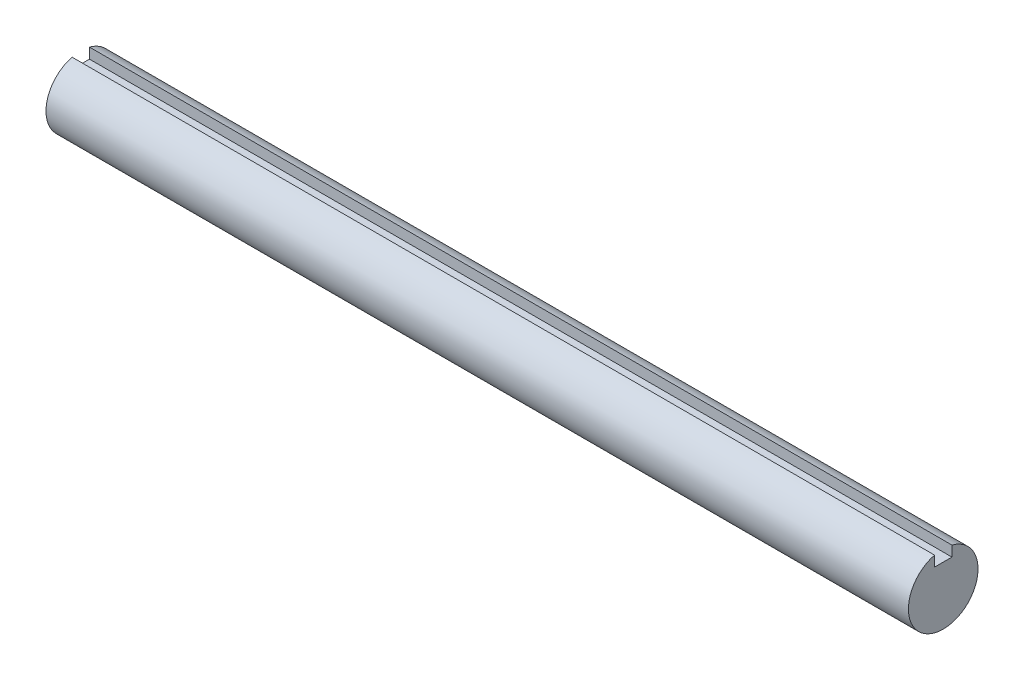
ISO-10303-21;
HEADER;
FILE_DESCRIPTION(('STEP AP214'),'2;1');
FILE_NAME('part.step','',(''),(''),'','','');
FILE_SCHEMA(('AUTOMOTIVE_DESIGN { 1 0 10303 214 1 1 1 1 }'));
ENDSEC;
DATA;
#1=APPLICATION_CONTEXT('core data for automotive mechanical design processes');
#2=APPLICATION_PROTOCOL_DEFINITION('international standard','automotive_design',2000,#1);
#3=PRODUCT_CONTEXT('',#1,'mechanical');
#4=PRODUCT('Part','Part','',(#3));
#5=PRODUCT_RELATED_PRODUCT_CATEGORY('part','',(#4));
#6=PRODUCT_DEFINITION_FORMATION('','',#4);
#7=PRODUCT_DEFINITION_CONTEXT('part definition',#1,'design');
#8=PRODUCT_DEFINITION('design','',#6,#7);
#9=PRODUCT_DEFINITION_SHAPE('','',#8);
#10=(LENGTH_UNIT() NAMED_UNIT(*) SI_UNIT(.MILLI.,.METRE.));
#11=(NAMED_UNIT(*) PLANE_ANGLE_UNIT() SI_UNIT($,.RADIAN.));
#12=(NAMED_UNIT(*) SI_UNIT($,.STERADIAN.) SOLID_ANGLE_UNIT());
#13=UNCERTAINTY_MEASURE_WITH_UNIT(LENGTH_MEASURE(1.E-05),#10,'distance_accuracy_value','');
#14=(GEOMETRIC_REPRESENTATION_CONTEXT(3) GLOBAL_UNCERTAINTY_ASSIGNED_CONTEXT((#13)) GLOBAL_UNIT_ASSIGNED_CONTEXT((#10,
#11,#12)) REPRESENTATION_CONTEXT('',''));
#15=CARTESIAN_POINT('',(0.,0.,0.));
#16=DIRECTION('',(0.,0.,1.));
#17=DIRECTION('',(1.,0.,0.));
#18=AXIS2_PLACEMENT_3D('',#15,#16,#17);
#19=CARTESIAN_POINT('',(0.,0.,0.));
#20=DIRECTION('',(1.,0.,0.));
#21=DIRECTION('',(0.,0.,-1.));
#22=AXIS2_PLACEMENT_3D('',#19,#20,#21);
#23=PLANE('',#22);
#24=CARTESIAN_POINT('',(0.,0.,0.));
#25=DIRECTION('',(1.,0.,0.));
#26=DIRECTION('',(0.,0.,-1.));
#27=AXIS2_PLACEMENT_3D('',#24,#25,#26);
#28=CIRCLE('',#27,4.000000001);
#29=CARTESIAN_POINT('',(0.,3.87298334724021,1.));
#30=VERTEX_POINT('',#29);
#31=CARTESIAN_POINT('',(0.,3.87298334724021,-1.));
#32=VERTEX_POINT('',#31);
#33=EDGE_CURVE('E106',#30,#32,#28,.T.);
#34=ORIENTED_EDGE('',*,*,#33,.F.);
#35=DIRECTION('',(0.,1.,0.));
#36=VECTOR('',#35,1.);
#37=CARTESIAN_POINT('',(0.,3.87298334724021,1.));
#38=LINE('',#37,#36);
#39=CARTESIAN_POINT('',(0.,2.67298334724021,1.));
#40=VERTEX_POINT('',#39);
#41=EDGE_CURVE('E121',#40,#30,#38,.T.);
#42=ORIENTED_EDGE('',*,*,#41,.F.);
#43=DIRECTION('',(0.,0.,1.));
#44=VECTOR('',#43,1.);
#45=CARTESIAN_POINT('',(0.,2.67298334724021,1.));
#46=LINE('',#45,#44);
#47=CARTESIAN_POINT('',(0.,2.67298334724021,-1.));
#48=VERTEX_POINT('',#47);
#49=EDGE_CURVE('E108',#48,#40,#46,.T.);
#50=ORIENTED_EDGE('',*,*,#49,.F.);
#51=DIRECTION('',(0.,-1.,0.));
#52=VECTOR('',#51,1.);
#53=CARTESIAN_POINT('',(0.,3.87298334724021,-1.));
#54=LINE('',#53,#52);
#55=EDGE_CURVE('E97',#32,#48,#54,.T.);
#56=ORIENTED_EDGE('',*,*,#55,.F.);
#57=EDGE_LOOP('',(#34,#42,#50,#56));
#58=FACE_BOUND('',#57,.T.);
#59=ADVANCED_FACE('F51',(#58),#23,.F.);
#60=CARTESIAN_POINT('',(110.347753508972,3.87298334724021,1.));
#61=DIRECTION('',(0.,0.,1.));
#62=DIRECTION('',(0.,-1.,0.));
#63=AXIS2_PLACEMENT_3D('',#60,#61,#62);
#64=PLANE('',#63);
#65=DIRECTION('',(-1.,0.,0.));
#66=VECTOR('',#65,1.);
#67=CARTESIAN_POINT('',(110.347753508972,3.87298334724021,1.));
#68=LINE('',#67,#66);
#69=CARTESIAN_POINT('',(99.1234999999998,3.87298334724021,1.));
#70=VERTEX_POINT('',#69);
#71=EDGE_CURVE('E112',#70,#30,#68,.T.);
#72=ORIENTED_EDGE('',*,*,#71,.F.);
#73=DIRECTION('',(0.,-1.,0.));
#74=VECTOR('',#73,1.);
#75=CARTESIAN_POINT('',(99.1234999999998,3.87298334724023,1.));
#76=LINE('',#75,#74);
#77=CARTESIAN_POINT('',(99.1234999999998,2.67298334724021,1.));
#78=VERTEX_POINT('',#77);
#79=EDGE_CURVE('E55',#70,#78,#76,.T.);
#80=ORIENTED_EDGE('',*,*,#79,.T.);
#81=DIRECTION('',(-1.,0.,0.));
#82=VECTOR('',#81,1.);
#83=CARTESIAN_POINT('',(110.347753508972,2.67298334724021,1.));
#84=LINE('',#83,#82);
#85=EDGE_CURVE('E126',#78,#40,#84,.T.);
#86=ORIENTED_EDGE('',*,*,#85,.T.);
#87=ORIENTED_EDGE('',*,*,#41,.T.);
#88=EDGE_LOOP('',(#72,#80,#86,#87));
#89=FACE_BOUND('',#88,.T.);
#90=ADVANCED_FACE('F136',(#89),#64,.F.);
#91=CARTESIAN_POINT('',(110.347753508972,2.67298334724021,1.));
#92=DIRECTION('',(0.,-1.,0.));
#93=DIRECTION('',(0.,0.,-1.));
#94=AXIS2_PLACEMENT_3D('',#91,#92,#93);
#95=PLANE('',#94);
#96=ORIENTED_EDGE('',*,*,#85,.F.);
#97=DIRECTION('',(0.,0.,-1.));
#98=VECTOR('',#97,1.);
#99=CARTESIAN_POINT('',(99.1234999999998,2.67298334724021,1.00000000000001));
#100=LINE('',#99,#98);
#101=CARTESIAN_POINT('',(99.1234999999998,2.67298334724021,-1.));
#102=VERTEX_POINT('',#101);
#103=EDGE_CURVE('E133',#78,#102,#100,.T.);
#104=ORIENTED_EDGE('',*,*,#103,.T.);
#105=DIRECTION('',(-1.,0.,0.));
#106=VECTOR('',#105,1.);
#107=CARTESIAN_POINT('',(110.347753508972,2.67298334724021,-1.));
#108=LINE('',#107,#106);
#109=EDGE_CURVE('E102',#102,#48,#108,.T.);
#110=ORIENTED_EDGE('',*,*,#109,.T.);
#111=ORIENTED_EDGE('',*,*,#49,.T.);
#112=EDGE_LOOP('',(#96,#104,#110,#111));
#113=FACE_BOUND('',#112,.T.);
#114=ADVANCED_FACE('F132',(#113),#95,.F.);
#115=CARTESIAN_POINT('',(110.347753508972,3.87298334724021,-1.));
#116=DIRECTION('',(0.,0.,-1.));
#117=DIRECTION('',(-1.,0.,0.));
#118=AXIS2_PLACEMENT_3D('',#115,#116,#117);
#119=PLANE('',#118);
#120=ORIENTED_EDGE('',*,*,#109,.F.);
#121=DIRECTION('',(0.,1.,0.));
#122=VECTOR('',#121,1.);
#123=CARTESIAN_POINT('',(99.1234999999998,3.87298334724023,-1.));
#124=LINE('',#123,#122);
#125=CARTESIAN_POINT('',(99.1234999999998,3.87298334724021,-1.));
#126=VERTEX_POINT('',#125);
#127=EDGE_CURVE('E60',#102,#126,#124,.T.);
#128=ORIENTED_EDGE('',*,*,#127,.T.);
#129=DIRECTION('',(-1.,0.,0.));
#130=VECTOR('',#129,1.);
#131=CARTESIAN_POINT('',(110.347753508972,3.87298334724021,-1.));
#132=LINE('',#131,#130);
#133=EDGE_CURVE('E94',#126,#32,#132,.T.);
#134=ORIENTED_EDGE('',*,*,#133,.T.);
#135=ORIENTED_EDGE('',*,*,#55,.T.);
#136=EDGE_LOOP('',(#120,#128,#134,#135));
#137=FACE_BOUND('',#136,.T.);
#138=ADVANCED_FACE('F96',(#137),#119,.F.);
#139=CARTESIAN_POINT('',(110.347753508972,0.,0.));
#140=DIRECTION('',(-1.,0.,0.));
#141=DIRECTION('',(0.,0.,1.));
#142=AXIS2_PLACEMENT_3D('',#139,#140,#141);
#143=CYLINDRICAL_SURFACE('',#142,4.000000001);
#144=ORIENTED_EDGE('',*,*,#133,.F.);
#145=CARTESIAN_POINT('',(99.1234999999998,0.,0.));
#146=DIRECTION('',(-1.,0.,0.));
#147=DIRECTION('',(0.,-1.,0.));
#148=AXIS2_PLACEMENT_3D('',#145,#146,#147);
#149=CIRCLE('',#148,4.000000001);
#150=EDGE_CURVE('E13',#126,#70,#149,.T.);
#151=ORIENTED_EDGE('',*,*,#150,.T.);
#152=ORIENTED_EDGE('',*,*,#71,.T.);
#153=ORIENTED_EDGE('',*,*,#33,.T.);
#154=EDGE_LOOP('',(#144,#151,#152,#153));
#155=FACE_BOUND('',#154,.T.);
#156=ADVANCED_FACE('F53',(#155),#143,.T.);
#157=CARTESIAN_POINT('',(99.1234999999998,4.81702309070732E-13,1.08792244581947E-13));
#158=DIRECTION('',(-1.,0.,0.));
#159=DIRECTION('',(0.,-0.985439500383709,-0.170026442306797));
#160=AXIS2_PLACEMENT_3D('',#157,#158,#159);
#161=PLANE('',#160);
#162=ORIENTED_EDGE('',*,*,#127,.F.);
#163=ORIENTED_EDGE('',*,*,#103,.F.);
#164=ORIENTED_EDGE('',*,*,#79,.F.);
#165=ORIENTED_EDGE('',*,*,#150,.F.);
#166=EDGE_LOOP('',(#162,#163,#164,#165));
#167=FACE_BOUND('',#166,.T.);
#168=ADVANCED_FACE('F150',(#167),#161,.F.);
#169=CLOSED_SHELL('',(#59,#90,#114,#138,#156,#168));
#170=MANIFOLD_SOLID_BREP('B2',#169);
#171=ADVANCED_BREP_SHAPE_REPRESENTATION('',(#18,#170),#14);
#172=SHAPE_DEFINITION_REPRESENTATION(#9,#171);
ENDSEC;
END-ISO-10303-21;
